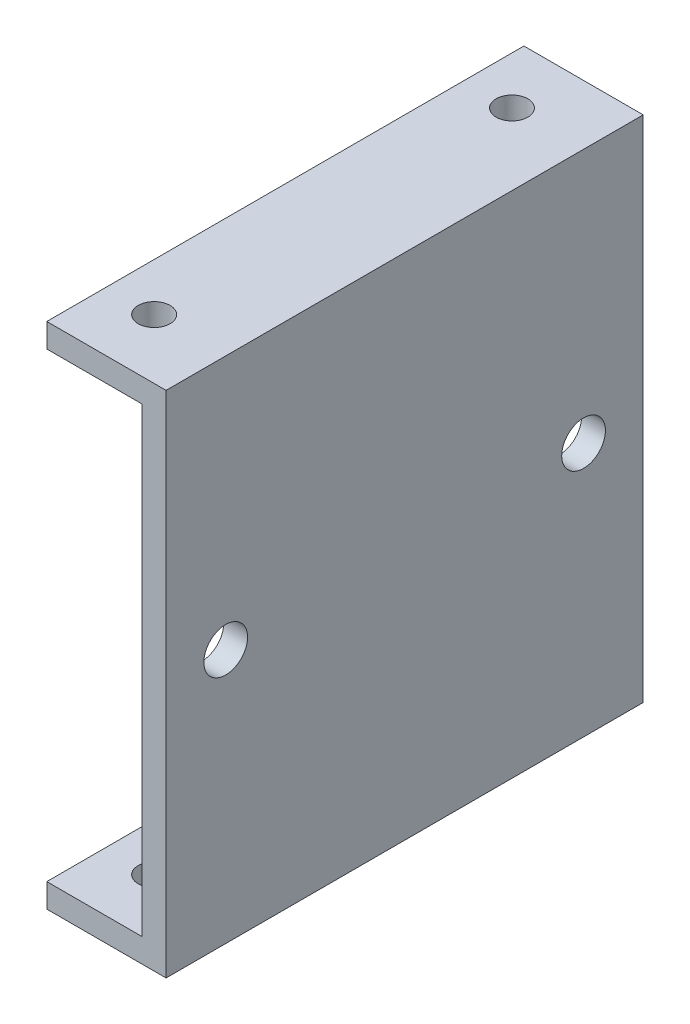
ISO-10303-21;
HEADER;
FILE_DESCRIPTION(('STEP AP214'),'2;1');
FILE_NAME('part.step','',(''),(''),'','','');
FILE_SCHEMA(('AUTOMOTIVE_DESIGN { 1 0 10303 214 1 1 1 1 }'));
ENDSEC;
DATA;
#1=APPLICATION_CONTEXT('core data for automotive mechanical design processes');
#2=APPLICATION_PROTOCOL_DEFINITION('international standard','automotive_design',2000,#1);
#3=PRODUCT_CONTEXT('',#1,'mechanical');
#4=PRODUCT('Part','Part','',(#3));
#5=PRODUCT_RELATED_PRODUCT_CATEGORY('part','',(#4));
#6=PRODUCT_DEFINITION_FORMATION('','',#4);
#7=PRODUCT_DEFINITION_CONTEXT('part definition',#1,'design');
#8=PRODUCT_DEFINITION('design','',#6,#7);
#9=PRODUCT_DEFINITION_SHAPE('','',#8);
#10=(LENGTH_UNIT() NAMED_UNIT(*) SI_UNIT(.MILLI.,.METRE.));
#11=(NAMED_UNIT(*) PLANE_ANGLE_UNIT() SI_UNIT($,.RADIAN.));
#12=(NAMED_UNIT(*) SI_UNIT($,.STERADIAN.) SOLID_ANGLE_UNIT());
#13=UNCERTAINTY_MEASURE_WITH_UNIT(LENGTH_MEASURE(1.E-05),#10,'distance_accuracy_value','');
#14=(GEOMETRIC_REPRESENTATION_CONTEXT(3) GLOBAL_UNCERTAINTY_ASSIGNED_CONTEXT((#13)) GLOBAL_UNIT_ASSIGNED_CONTEXT((#10,
#11,#12)) REPRESENTATION_CONTEXT('',''));
#15=CARTESIAN_POINT('',(0.,0.,0.));
#16=DIRECTION('',(0.,0.,1.));
#17=DIRECTION('',(1.,0.,0.));
#18=AXIS2_PLACEMENT_3D('',#15,#16,#17);
#19=CARTESIAN_POINT('',(0.,0.,30.));
#20=DIRECTION('',(1.,0.,0.));
#21=DIRECTION('',(0.,0.,-1.));
#22=AXIS2_PLACEMENT_3D('',#19,#20,#21);
#23=PLANE('',#22);
#24=DIRECTION('',(0.,-1.,0.));
#25=VECTOR('',#24,1.);
#26=CARTESIAN_POINT('',(0.,0.,-30.));
#27=LINE('',#26,#25);
#28=CARTESIAN_POINT('',(0.,0.,-30.));
#29=VERTEX_POINT('',#28);
#30=CARTESIAN_POINT('',(0.,-3.,-30.));
#31=VERTEX_POINT('',#30);
#32=EDGE_CURVE('E135',#29,#31,#27,.T.);
#33=ORIENTED_EDGE('',*,*,#32,.T.);
#34=DIRECTION('',(0.,0.,-1.));
#35=VECTOR('',#34,1.);
#36=CARTESIAN_POINT('',(0.,-3.,30.));
#37=LINE('',#36,#35);
#38=CARTESIAN_POINT('',(0.,-3.,30.));
#39=VERTEX_POINT('',#38);
#40=EDGE_CURVE('E11',#39,#31,#37,.T.);
#41=ORIENTED_EDGE('',*,*,#40,.F.);
#42=DIRECTION('',(0.,-1.,0.));
#43=VECTOR('',#42,1.);
#44=CARTESIAN_POINT('',(0.,0.,30.));
#45=LINE('',#44,#43);
#46=CARTESIAN_POINT('',(0.,0.,30.));
#47=VERTEX_POINT('',#46);
#48=EDGE_CURVE('E150',#47,#39,#45,.T.);
#49=ORIENTED_EDGE('',*,*,#48,.F.);
#50=DIRECTION('',(0.,0.,-1.));
#51=VECTOR('',#50,1.);
#52=CARTESIAN_POINT('',(0.,0.,30.));
#53=LINE('',#52,#51);
#54=EDGE_CURVE('E131',#47,#29,#53,.T.);
#55=ORIENTED_EDGE('',*,*,#54,.T.);
#56=EDGE_LOOP('',(#33,#41,#49,#55));
#57=FACE_BOUND('',#56,.T.);
#58=ADVANCED_FACE('F37',(#57),#23,.F.);
#59=CARTESIAN_POINT('',(0.,-3.,30.));
#60=DIRECTION('',(0.,1.,0.));
#61=DIRECTION('',(0.,0.,1.));
#62=AXIS2_PLACEMENT_3D('',#59,#60,#61);
#63=PLANE('',#62);
#64=CARTESIAN_POINT('',(6.,-3.,22.5));
#65=DIRECTION('',(0.,1.,0.));
#66=DIRECTION('',(0.,0.,1.));
#67=AXIS2_PLACEMENT_3D('',#64,#65,#66);
#68=CIRCLE('',#67,1.99999999999999);
#69=CARTESIAN_POINT('',(6.,-3.,24.5));
#70=VERTEX_POINT('',#69);
#71=EDGE_CURVE('E170',#70,#70,#68,.T.);
#72=ORIENTED_EDGE('',*,*,#71,.T.);
#73=EDGE_LOOP('',(#72));
#74=FACE_BOUND('',#73,.T.);
#75=CARTESIAN_POINT('',(6.,-3.,-22.5));
#76=DIRECTION('',(0.,1.,0.));
#77=DIRECTION('',(0.,0.,1.));
#78=AXIS2_PLACEMENT_3D('',#75,#76,#77);
#79=CIRCLE('',#78,1.99999999999999);
#80=CARTESIAN_POINT('',(6.,-3.,-20.5));
#81=VERTEX_POINT('',#80);
#82=EDGE_CURVE('E139',#81,#81,#79,.T.);
#83=ORIENTED_EDGE('',*,*,#82,.T.);
#84=EDGE_LOOP('',(#83));
#85=FACE_BOUND('',#84,.T.);
#86=DIRECTION('',(1.,0.,0.));
#87=VECTOR('',#86,1.);
#88=CARTESIAN_POINT('',(0.,-3.,-30.));
#89=LINE('',#88,#87);
#90=CARTESIAN_POINT('',(12.,-3.,-30.));
#91=VERTEX_POINT('',#90);
#92=EDGE_CURVE('E138',#31,#91,#89,.T.);
#93=ORIENTED_EDGE('',*,*,#92,.T.);
#94=DIRECTION('',(0.,0.,-1.));
#95=VECTOR('',#94,1.);
#96=CARTESIAN_POINT('',(12.,-3.,30.));
#97=LINE('',#96,#95);
#98=CARTESIAN_POINT('',(12.,-3.,30.));
#99=VERTEX_POINT('',#98);
#100=EDGE_CURVE('E46',#99,#91,#97,.T.);
#101=ORIENTED_EDGE('',*,*,#100,.F.);
#102=DIRECTION('',(1.,0.,0.));
#103=VECTOR('',#102,1.);
#104=CARTESIAN_POINT('',(0.,-3.,30.));
#105=LINE('',#104,#103);
#106=EDGE_CURVE('E98',#39,#99,#105,.T.);
#107=ORIENTED_EDGE('',*,*,#106,.F.);
#108=ORIENTED_EDGE('',*,*,#40,.T.);
#109=EDGE_LOOP('',(#93,#101,#107,#108));
#110=FACE_BOUND('',#109,.T.);
#111=ADVANCED_FACE('F218',(#74,#85,#110),#63,.F.);
#112=CARTESIAN_POINT('',(12.,-3.,30.));
#113=DIRECTION('',(1.,0.,0.));
#114=DIRECTION('',(0.,1.,0.));
#115=AXIS2_PLACEMENT_3D('',#112,#113,#114);
#116=PLANE('',#115);
#117=CARTESIAN_POINT('',(12.,-32.,-22.5));
#118=DIRECTION('',(1.,0.,0.));
#119=DIRECTION('',(0.,1.,0.));
#120=AXIS2_PLACEMENT_3D('',#117,#118,#119);
#121=CIRCLE('',#120,2.75);
#122=CARTESIAN_POINT('',(12.,-29.25,-22.5));
#123=VERTEX_POINT('',#122);
#124=EDGE_CURVE('E327',#123,#123,#121,.T.);
#125=ORIENTED_EDGE('',*,*,#124,.T.);
#126=EDGE_LOOP('',(#125));
#127=FACE_BOUND('',#126,.T.);
#128=CARTESIAN_POINT('',(12.,-32.,22.5));
#129=DIRECTION('',(1.,0.,0.));
#130=DIRECTION('',(0.,1.,0.));
#131=AXIS2_PLACEMENT_3D('',#128,#129,#130);
#132=CIRCLE('',#131,2.75);
#133=CARTESIAN_POINT('',(12.,-29.25,22.5));
#134=VERTEX_POINT('',#133);
#135=EDGE_CURVE('E245',#134,#134,#132,.T.);
#136=ORIENTED_EDGE('',*,*,#135,.T.);
#137=EDGE_LOOP('',(#136));
#138=FACE_BOUND('',#137,.T.);
#139=DIRECTION('',(0.,-1.,0.));
#140=VECTOR('',#139,1.);
#141=CARTESIAN_POINT('',(12.,-3.,-30.));
#142=LINE('',#141,#140);
#143=CARTESIAN_POINT('',(12.,-60.9999999999999,-30.));
#144=VERTEX_POINT('',#143);
#145=EDGE_CURVE('E141',#91,#144,#142,.T.);
#146=ORIENTED_EDGE('',*,*,#145,.T.);
#147=DIRECTION('',(0.,0.,-1.));
#148=VECTOR('',#147,1.);
#149=CARTESIAN_POINT('',(12.,-60.9999999999999,30.));
#150=LINE('',#149,#148);
#151=CARTESIAN_POINT('',(12.,-60.9999999999999,30.));
#152=VERTEX_POINT('',#151);
#153=EDGE_CURVE('E157',#152,#144,#150,.T.);
#154=ORIENTED_EDGE('',*,*,#153,.F.);
#155=DIRECTION('',(0.,-1.,0.));
#156=VECTOR('',#155,1.);
#157=CARTESIAN_POINT('',(12.,-3.,30.));
#158=LINE('',#157,#156);
#159=EDGE_CURVE('E183',#99,#152,#158,.T.);
#160=ORIENTED_EDGE('',*,*,#159,.F.);
#161=ORIENTED_EDGE('',*,*,#100,.T.);
#162=EDGE_LOOP('',(#146,#154,#160,#161));
#163=FACE_BOUND('',#162,.T.);
#164=ADVANCED_FACE('F222',(#127,#138,#163),#116,.F.);
#165=CARTESIAN_POINT('',(12.,-60.9999999999999,30.));
#166=DIRECTION('',(0.,-1.,0.));
#167=DIRECTION('',(0.,0.,-1.));
#168=AXIS2_PLACEMENT_3D('',#165,#166,#167);
#169=PLANE('',#168);
#170=CARTESIAN_POINT('',(6.,-60.9999999999999,22.5));
#171=DIRECTION('',(0.,-1.,0.));
#172=DIRECTION('',(0.,0.,-1.));
#173=AXIS2_PLACEMENT_3D('',#170,#171,#172);
#174=CIRCLE('',#173,1.99999999999999);
#175=CARTESIAN_POINT('',(6.,-60.9999999999999,20.5));
#176=VERTEX_POINT('',#175);
#177=EDGE_CURVE('E175',#176,#176,#174,.T.);
#178=ORIENTED_EDGE('',*,*,#177,.T.);
#179=EDGE_LOOP('',(#178));
#180=FACE_BOUND('',#179,.T.);
#181=CARTESIAN_POINT('',(6.,-60.9999999999999,-22.5));
#182=DIRECTION('',(0.,-1.,0.));
#183=DIRECTION('',(0.,0.,-1.));
#184=AXIS2_PLACEMENT_3D('',#181,#182,#183);
#185=CIRCLE('',#184,1.99999999999999);
#186=CARTESIAN_POINT('',(6.,-60.9999999999999,-24.5));
#187=VERTEX_POINT('',#186);
#188=EDGE_CURVE('E163',#187,#187,#185,.T.);
#189=ORIENTED_EDGE('',*,*,#188,.T.);
#190=EDGE_LOOP('',(#189));
#191=FACE_BOUND('',#190,.T.);
#192=DIRECTION('',(-1.,0.,0.));
#193=VECTOR('',#192,1.);
#194=CARTESIAN_POINT('',(12.,-60.9999999999999,-30.));
#195=LINE('',#194,#193);
#196=CARTESIAN_POINT('',(0.,-60.9999999999999,-30.));
#197=VERTEX_POINT('',#196);
#198=EDGE_CURVE('E143',#144,#197,#195,.T.);
#199=ORIENTED_EDGE('',*,*,#198,.T.);
#200=DIRECTION('',(0.,0.,-1.));
#201=VECTOR('',#200,1.);
#202=CARTESIAN_POINT('',(0.,-60.9999999999999,30.));
#203=LINE('',#202,#201);
#204=CARTESIAN_POINT('',(0.,-60.9999999999999,30.));
#205=VERTEX_POINT('',#204);
#206=EDGE_CURVE('E154',#205,#197,#203,.T.);
#207=ORIENTED_EDGE('',*,*,#206,.F.);
#208=DIRECTION('',(-1.,0.,0.));
#209=VECTOR('',#208,1.);
#210=CARTESIAN_POINT('',(12.,-60.9999999999999,30.));
#211=LINE('',#210,#209);
#212=EDGE_CURVE('E185',#152,#205,#211,.T.);
#213=ORIENTED_EDGE('',*,*,#212,.F.);
#214=ORIENTED_EDGE('',*,*,#153,.T.);
#215=EDGE_LOOP('',(#199,#207,#213,#214));
#216=FACE_BOUND('',#215,.T.);
#217=ADVANCED_FACE('F191',(#180,#191,#216),#169,.F.);
#218=CARTESIAN_POINT('',(0.,-60.9999999999999,30.));
#219=DIRECTION('',(1.,0.,0.));
#220=DIRECTION('',(0.,1.,0.));
#221=AXIS2_PLACEMENT_3D('',#218,#219,#220);
#222=PLANE('',#221);
#223=DIRECTION('',(0.,-1.,0.));
#224=VECTOR('',#223,1.);
#225=CARTESIAN_POINT('',(0.,-60.9999999999999,-30.));
#226=LINE('',#225,#224);
#227=CARTESIAN_POINT('',(0.,-63.9999999999999,-30.));
#228=VERTEX_POINT('',#227);
#229=EDGE_CURVE('E145',#197,#228,#226,.T.);
#230=ORIENTED_EDGE('',*,*,#229,.T.);
#231=DIRECTION('',(0.,0.,-1.));
#232=VECTOR('',#231,1.);
#233=CARTESIAN_POINT('',(0.,-63.9999999999999,30.));
#234=LINE('',#233,#232);
#235=CARTESIAN_POINT('',(0.,-63.9999999999999,30.));
#236=VERTEX_POINT('',#235);
#237=EDGE_CURVE('E126',#236,#228,#234,.T.);
#238=ORIENTED_EDGE('',*,*,#237,.F.);
#239=DIRECTION('',(0.,-1.,0.));
#240=VECTOR('',#239,1.);
#241=CARTESIAN_POINT('',(0.,-60.9999999999999,30.));
#242=LINE('',#241,#240);
#243=EDGE_CURVE('E117',#205,#236,#242,.T.);
#244=ORIENTED_EDGE('',*,*,#243,.F.);
#245=ORIENTED_EDGE('',*,*,#206,.T.);
#246=EDGE_LOOP('',(#230,#238,#244,#245));
#247=FACE_BOUND('',#246,.T.);
#248=ADVANCED_FACE('F195',(#247),#222,.F.);
#249=CARTESIAN_POINT('',(15.,-63.9999999999999,30.));
#250=DIRECTION('',(0.,1.,0.));
#251=DIRECTION('',(0.,0.,1.));
#252=AXIS2_PLACEMENT_3D('',#249,#250,#251);
#253=PLANE('',#252);
#254=CARTESIAN_POINT('',(6.,-63.9999999999999,22.5));
#255=DIRECTION('',(0.,1.,0.));
#256=DIRECTION('',(0.,0.,1.));
#257=AXIS2_PLACEMENT_3D('',#254,#255,#256);
#258=CIRCLE('',#257,1.99999999999999);
#259=CARTESIAN_POINT('',(6.,-63.9999999999999,24.5));
#260=VERTEX_POINT('',#259);
#261=EDGE_CURVE('E243',#260,#260,#258,.T.);
#262=ORIENTED_EDGE('',*,*,#261,.T.);
#263=EDGE_LOOP('',(#262));
#264=FACE_BOUND('',#263,.T.);
#265=CARTESIAN_POINT('',(6.,-63.9999999999999,-22.5));
#266=DIRECTION('',(0.,1.,0.));
#267=DIRECTION('',(0.,0.,1.));
#268=AXIS2_PLACEMENT_3D('',#265,#266,#267);
#269=CIRCLE('',#268,1.99999999999999);
#270=CARTESIAN_POINT('',(6.,-63.9999999999999,-20.5));
#271=VERTEX_POINT('',#270);
#272=EDGE_CURVE('E164',#271,#271,#269,.T.);
#273=ORIENTED_EDGE('',*,*,#272,.T.);
#274=EDGE_LOOP('',(#273));
#275=FACE_BOUND('',#274,.T.);
#276=DIRECTION('',(1.,0.,0.));
#277=VECTOR('',#276,1.);
#278=CARTESIAN_POINT('',(15.,-63.9999999999999,-30.));
#279=LINE('',#278,#277);
#280=CARTESIAN_POINT('',(15.,-63.9999999999999,-30.));
#281=VERTEX_POINT('',#280);
#282=EDGE_CURVE('E125',#228,#281,#279,.T.);
#283=ORIENTED_EDGE('',*,*,#282,.T.);
#284=DIRECTION('',(0.,0.,-1.));
#285=VECTOR('',#284,1.);
#286=CARTESIAN_POINT('',(15.,-63.9999999999999,30.));
#287=LINE('',#286,#285);
#288=CARTESIAN_POINT('',(15.,-63.9999999999999,30.));
#289=VERTEX_POINT('',#288);
#290=EDGE_CURVE('E122',#289,#281,#287,.T.);
#291=ORIENTED_EDGE('',*,*,#290,.F.);
#292=DIRECTION('',(1.,0.,0.));
#293=VECTOR('',#292,1.);
#294=CARTESIAN_POINT('',(15.,-63.9999999999999,30.));
#295=LINE('',#294,#293);
#296=EDGE_CURVE('E111',#236,#289,#295,.T.);
#297=ORIENTED_EDGE('',*,*,#296,.F.);
#298=ORIENTED_EDGE('',*,*,#237,.T.);
#299=EDGE_LOOP('',(#283,#291,#297,#298));
#300=FACE_BOUND('',#299,.T.);
#301=ADVANCED_FACE('F123',(#264,#275,#300),#253,.F.);
#302=CARTESIAN_POINT('',(15.,0.,30.));
#303=DIRECTION('',(-1.,0.,0.));
#304=DIRECTION('',(0.,-1.,0.));
#305=AXIS2_PLACEMENT_3D('',#302,#303,#304);
#306=PLANE('',#305);
#307=CARTESIAN_POINT('',(15.,-32.,-22.5));
#308=DIRECTION('',(1.,0.,0.));
#309=DIRECTION('',(0.,1.,0.));
#310=AXIS2_PLACEMENT_3D('',#307,#308,#309);
#311=CIRCLE('',#310,2.75);
#312=CARTESIAN_POINT('',(15.,-29.25,-22.5));
#313=VERTEX_POINT('',#312);
#314=EDGE_CURVE('E324',#313,#313,#311,.T.);
#315=ORIENTED_EDGE('',*,*,#314,.F.);
#316=EDGE_LOOP('',(#315));
#317=FACE_BOUND('',#316,.T.);
#318=CARTESIAN_POINT('',(15.,-32.,22.5));
#319=DIRECTION('',(1.,0.,0.));
#320=DIRECTION('',(0.,1.,0.));
#321=AXIS2_PLACEMENT_3D('',#318,#319,#320);
#322=CIRCLE('',#321,2.75);
#323=CARTESIAN_POINT('',(15.,-29.25,22.5));
#324=VERTEX_POINT('',#323);
#325=EDGE_CURVE('E248',#324,#324,#322,.T.);
#326=ORIENTED_EDGE('',*,*,#325,.F.);
#327=EDGE_LOOP('',(#326));
#328=FACE_BOUND('',#327,.T.);
#329=DIRECTION('',(0.,1.,0.));
#330=VECTOR('',#329,1.);
#331=CARTESIAN_POINT('',(15.,0.,-30.));
#332=LINE('',#331,#330);
#333=CARTESIAN_POINT('',(15.,0.,-30.));
#334=VERTEX_POINT('',#333);
#335=EDGE_CURVE('E84',#281,#334,#332,.T.);
#336=ORIENTED_EDGE('',*,*,#335,.T.);
#337=DIRECTION('',(0.,0.,-1.));
#338=VECTOR('',#337,1.);
#339=CARTESIAN_POINT('',(15.,0.,30.));
#340=LINE('',#339,#338);
#341=CARTESIAN_POINT('',(15.,0.,30.));
#342=VERTEX_POINT('',#341);
#343=EDGE_CURVE('E127',#342,#334,#340,.T.);
#344=ORIENTED_EDGE('',*,*,#343,.F.);
#345=DIRECTION('',(0.,1.,0.));
#346=VECTOR('',#345,1.);
#347=CARTESIAN_POINT('',(15.,0.,30.));
#348=LINE('',#347,#346);
#349=EDGE_CURVE('E115',#289,#342,#348,.T.);
#350=ORIENTED_EDGE('',*,*,#349,.F.);
#351=ORIENTED_EDGE('',*,*,#290,.T.);
#352=EDGE_LOOP('',(#336,#344,#350,#351));
#353=FACE_BOUND('',#352,.T.);
#354=ADVANCED_FACE('F129',(#317,#328,#353),#306,.F.);
#355=CARTESIAN_POINT('',(0.,0.,30.));
#356=DIRECTION('',(0.,-1.,0.));
#357=DIRECTION('',(0.,0.,-1.));
#358=AXIS2_PLACEMENT_3D('',#355,#356,#357);
#359=PLANE('',#358);
#360=CARTESIAN_POINT('',(6.,0.,22.5));
#361=DIRECTION('',(0.,-1.,0.));
#362=DIRECTION('',(0.,0.,-1.));
#363=AXIS2_PLACEMENT_3D('',#360,#361,#362);
#364=CIRCLE('',#363,1.99999999999999);
#365=CARTESIAN_POINT('',(6.,0.,20.5));
#366=VERTEX_POINT('',#365);
#367=EDGE_CURVE('E40',#366,#366,#364,.T.);
#368=ORIENTED_EDGE('',*,*,#367,.T.);
#369=EDGE_LOOP('',(#368));
#370=FACE_BOUND('',#369,.T.);
#371=CARTESIAN_POINT('',(6.,0.,-22.5));
#372=DIRECTION('',(0.,-1.,0.));
#373=DIRECTION('',(0.,0.,-1.));
#374=AXIS2_PLACEMENT_3D('',#371,#372,#373);
#375=CIRCLE('',#374,1.99999999999999);
#376=CARTESIAN_POINT('',(6.,0.,-24.5));
#377=VERTEX_POINT('',#376);
#378=EDGE_CURVE('E161',#377,#377,#375,.T.);
#379=ORIENTED_EDGE('',*,*,#378,.T.);
#380=EDGE_LOOP('',(#379));
#381=FACE_BOUND('',#380,.T.);
#382=DIRECTION('',(-1.,0.,0.));
#383=VECTOR('',#382,1.);
#384=CARTESIAN_POINT('',(0.,0.,-30.));
#385=LINE('',#384,#383);
#386=EDGE_CURVE('E90',#334,#29,#385,.T.);
#387=ORIENTED_EDGE('',*,*,#386,.T.);
#388=ORIENTED_EDGE('',*,*,#54,.F.);
#389=DIRECTION('',(-1.,0.,0.));
#390=VECTOR('',#389,1.);
#391=CARTESIAN_POINT('',(0.,0.,30.));
#392=LINE('',#391,#390);
#393=EDGE_CURVE('E55',#342,#47,#392,.T.);
#394=ORIENTED_EDGE('',*,*,#393,.F.);
#395=ORIENTED_EDGE('',*,*,#343,.T.);
#396=EDGE_LOOP('',(#387,#388,#394,#395));
#397=FACE_BOUND('',#396,.T.);
#398=ADVANCED_FACE('F203',(#370,#381,#397),#359,.F.);
#399=CARTESIAN_POINT('',(0.,0.,30.));
#400=DIRECTION('',(0.,0.,1.));
#401=DIRECTION('',(1.,0.,0.));
#402=AXIS2_PLACEMENT_3D('',#399,#400,#401);
#403=PLANE('',#402);
#404=ORIENTED_EDGE('',*,*,#48,.T.);
#405=ORIENTED_EDGE('',*,*,#106,.T.);
#406=ORIENTED_EDGE('',*,*,#159,.T.);
#407=ORIENTED_EDGE('',*,*,#212,.T.);
#408=ORIENTED_EDGE('',*,*,#243,.T.);
#409=ORIENTED_EDGE('',*,*,#296,.T.);
#410=ORIENTED_EDGE('',*,*,#349,.T.);
#411=ORIENTED_EDGE('',*,*,#393,.T.);
#412=EDGE_LOOP('',(#404,#405,#406,#407,#408,#409,#410,#411));
#413=FACE_BOUND('',#412,.T.);
#414=ADVANCED_FACE('F113',(#413),#403,.T.);
#415=CARTESIAN_POINT('',(0.,0.,-30.));
#416=DIRECTION('',(0.,0.,1.));
#417=DIRECTION('',(1.,0.,0.));
#418=AXIS2_PLACEMENT_3D('',#415,#416,#417);
#419=PLANE('',#418);
#420=ORIENTED_EDGE('',*,*,#32,.F.);
#421=ORIENTED_EDGE('',*,*,#386,.F.);
#422=ORIENTED_EDGE('',*,*,#335,.F.);
#423=ORIENTED_EDGE('',*,*,#282,.F.);
#424=ORIENTED_EDGE('',*,*,#229,.F.);
#425=ORIENTED_EDGE('',*,*,#198,.F.);
#426=ORIENTED_EDGE('',*,*,#145,.F.);
#427=ORIENTED_EDGE('',*,*,#92,.F.);
#428=EDGE_LOOP('',(#420,#421,#422,#423,#424,#425,#426,#427));
#429=FACE_BOUND('',#428,.T.);
#430=ADVANCED_FACE('F198',(#429),#419,.F.);
#431=CARTESIAN_POINT('',(6.,-63.9999999999999,-22.5));
#432=DIRECTION('',(0.,1.,0.));
#433=DIRECTION('',(0.,0.,1.));
#434=AXIS2_PLACEMENT_3D('',#431,#432,#433);
#435=CYLINDRICAL_SURFACE('',#434,1.99999999999999);
#436=ORIENTED_EDGE('',*,*,#378,.F.);
#437=EDGE_LOOP('',(#436));
#438=FACE_BOUND('',#437,.T.);
#439=ORIENTED_EDGE('',*,*,#82,.F.);
#440=EDGE_LOOP('',(#439));
#441=FACE_BOUND('',#440,.T.);
#442=ADVANCED_FACE('F271',(#438,#441),#435,.F.);
#443=ORIENTED_EDGE('',*,*,#272,.F.);
#444=EDGE_LOOP('',(#443));
#445=FACE_BOUND('',#444,.T.);
#446=ORIENTED_EDGE('',*,*,#188,.F.);
#447=EDGE_LOOP('',(#446));
#448=FACE_BOUND('',#447,.T.);
#449=ADVANCED_FACE('F267',(#445,#448),#435,.F.);
#450=CARTESIAN_POINT('',(6.,-63.9999999999999,22.5));
#451=DIRECTION('',(0.,1.,0.));
#452=DIRECTION('',(0.,0.,1.));
#453=AXIS2_PLACEMENT_3D('',#450,#451,#452);
#454=CYLINDRICAL_SURFACE('',#453,1.99999999999999);
#455=ORIENTED_EDGE('',*,*,#367,.F.);
#456=EDGE_LOOP('',(#455));
#457=FACE_BOUND('',#456,.T.);
#458=ORIENTED_EDGE('',*,*,#71,.F.);
#459=EDGE_LOOP('',(#458));
#460=FACE_BOUND('',#459,.T.);
#461=ADVANCED_FACE('F258',(#457,#460),#454,.F.);
#462=ORIENTED_EDGE('',*,*,#261,.F.);
#463=EDGE_LOOP('',(#462));
#464=FACE_BOUND('',#463,.T.);
#465=ORIENTED_EDGE('',*,*,#177,.F.);
#466=EDGE_LOOP('',(#465));
#467=FACE_BOUND('',#466,.T.);
#468=ADVANCED_FACE('F255',(#464,#467),#454,.F.);
#469=CARTESIAN_POINT('',(0.,-32.,22.5));
#470=DIRECTION('',(1.,0.,0.));
#471=DIRECTION('',(0.,1.,0.));
#472=AXIS2_PLACEMENT_3D('',#469,#470,#471);
#473=CYLINDRICAL_SURFACE('',#472,2.75);
#474=CARTESIAN_POINT('',(15.,-29.25,22.5));
#475=CARTESIAN_POINT('',(14.96875,-29.25,22.5));
#476=CARTESIAN_POINT('',(14.9375,-29.25,22.5));
#477=CARTESIAN_POINT('',(14.875,-29.25,22.5));
#478=CARTESIAN_POINT('',(14.84375,-29.25,22.5));
#479=CARTESIAN_POINT('',(14.78125,-29.25,22.5));
#480=CARTESIAN_POINT('',(14.75,-29.25,22.5));
#481=CARTESIAN_POINT('',(14.6875,-29.25,22.5));
#482=CARTESIAN_POINT('',(14.65625,-29.25,22.5));
#483=CARTESIAN_POINT('',(14.59375,-29.25,22.5));
#484=CARTESIAN_POINT('',(14.5625,-29.25,22.5));
#485=CARTESIAN_POINT('',(14.5,-29.25,22.5));
#486=CARTESIAN_POINT('',(14.46875,-29.25,22.5));
#487=CARTESIAN_POINT('',(14.40625,-29.25,22.5));
#488=CARTESIAN_POINT('',(14.375,-29.25,22.5));
#489=CARTESIAN_POINT('',(14.3125,-29.25,22.5));
#490=CARTESIAN_POINT('',(14.28125,-29.25,22.5));
#491=CARTESIAN_POINT('',(14.21875,-29.25,22.5));
#492=CARTESIAN_POINT('',(14.1875,-29.25,22.5));
#493=CARTESIAN_POINT('',(14.125,-29.25,22.5));
#494=CARTESIAN_POINT('',(14.09375,-29.25,22.5));
#495=CARTESIAN_POINT('',(14.03125,-29.25,22.5));
#496=CARTESIAN_POINT('',(14.,-29.25,22.5));
#497=CARTESIAN_POINT('',(13.9375,-29.25,22.5));
#498=CARTESIAN_POINT('',(13.90625,-29.25,22.5));
#499=CARTESIAN_POINT('',(13.84375,-29.25,22.5));
#500=CARTESIAN_POINT('',(13.8125,-29.25,22.5));
#501=CARTESIAN_POINT('',(13.75,-29.25,22.5));
#502=CARTESIAN_POINT('',(13.71875,-29.25,22.5));
#503=CARTESIAN_POINT('',(13.65625,-29.25,22.5));
#504=CARTESIAN_POINT('',(13.625,-29.25,22.5));
#505=CARTESIAN_POINT('',(13.5625,-29.25,22.5));
#506=CARTESIAN_POINT('',(13.53125,-29.25,22.5));
#507=CARTESIAN_POINT('',(13.46875,-29.25,22.5));
#508=CARTESIAN_POINT('',(13.4375,-29.25,22.5));
#509=CARTESIAN_POINT('',(13.375,-29.25,22.5));
#510=CARTESIAN_POINT('',(13.34375,-29.25,22.5));
#511=CARTESIAN_POINT('',(13.28125,-29.25,22.5));
#512=CARTESIAN_POINT('',(13.25,-29.25,22.5));
#513=CARTESIAN_POINT('',(13.1875,-29.25,22.5));
#514=CARTESIAN_POINT('',(13.15625,-29.25,22.5));
#515=CARTESIAN_POINT('',(13.09375,-29.25,22.5));
#516=CARTESIAN_POINT('',(13.0625,-29.25,22.5));
#517=CARTESIAN_POINT('',(13.,-29.25,22.5));
#518=CARTESIAN_POINT('',(12.96875,-29.25,22.5));
#519=CARTESIAN_POINT('',(12.90625,-29.25,22.5));
#520=CARTESIAN_POINT('',(12.875,-29.25,22.5));
#521=CARTESIAN_POINT('',(12.8125,-29.25,22.5));
#522=CARTESIAN_POINT('',(12.78125,-29.25,22.5));
#523=CARTESIAN_POINT('',(12.71875,-29.25,22.5));
#524=CARTESIAN_POINT('',(12.6875,-29.25,22.5));
#525=CARTESIAN_POINT('',(12.625,-29.25,22.5));
#526=CARTESIAN_POINT('',(12.59375,-29.25,22.5));
#527=CARTESIAN_POINT('',(12.53125,-29.25,22.5));
#528=CARTESIAN_POINT('',(12.5,-29.25,22.5));
#529=CARTESIAN_POINT('',(12.4375,-29.25,22.5));
#530=CARTESIAN_POINT('',(12.40625,-29.25,22.5));
#531=CARTESIAN_POINT('',(12.34375,-29.25,22.5));
#532=CARTESIAN_POINT('',(12.3125,-29.25,22.5));
#533=CARTESIAN_POINT('',(12.25,-29.25,22.5));
#534=CARTESIAN_POINT('',(12.21875,-29.25,22.5));
#535=CARTESIAN_POINT('',(12.15625,-29.25,22.5));
#536=CARTESIAN_POINT('',(12.125,-29.25,22.5));
#537=CARTESIAN_POINT('',(12.0625,-29.25,22.5));
#538=CARTESIAN_POINT('',(12.03125,-29.25,22.5));
#539=CARTESIAN_POINT('',(12.,-29.25,22.5));
#540=B_SPLINE_CURVE_WITH_KNOTS('',3,(#474,#475,#476,#477,#478,#479,#480,#481,#482,#483,#484,
#485,#486,#487,#488,#489,#490,#491,#492,#493,#494,#495,#496,#497,#498,#499,#500,#501,#502,#503,
#504,#505,#506,#507,#508,#509,#510,#511,#512,#513,#514,#515,#516,#517,#518,#519,#520,#521,#522,
#523,#524,#525,#526,#527,#528,#529,#530,#531,#532,#533,#534,#535,#536,#537,#538,#539),
.UNSPECIFIED.,.F.,.F.,(4,2,2,2,2,2,2,2,2,2,2,2,2,2,2,2,2,2,2,2,2,2,2,2,2,2,2,2,2,2,2,2,4),(0.,
0.0937500000000001,0.1875,0.28125,0.375,0.468749999999999,0.562499999999999,0.656249999999999,
0.749999999999999,0.843749999999999,0.937499999999999,1.03125,1.125,1.21875,1.3125,1.40625,1.5,
1.59375,1.6875,1.78125,1.875,1.96875,2.0625,2.15625,2.25,2.34375,2.4375,2.53125,2.625,2.71875,
2.8125,2.90625,3.),.UNSPECIFIED.);
#541=EDGE_CURVE('BSEAM257',#324,#134,#540,.T.);
#542=ORIENTED_EDGE('',*,*,#325,.T.);
#543=ORIENTED_EDGE('',*,*,#135,.F.);
#544=ORIENTED_EDGE('',*,*,#541,.T.);
#545=ORIENTED_EDGE('',*,*,#541,.F.);
#546=EDGE_LOOP('',(#542,#544,#543,#545));
#547=FACE_BOUND('',#546,.T.);
#548=ADVANCED_FACE('F257',(#547),#473,.F.);
#549=CARTESIAN_POINT('',(0.,-32.,-22.5));
#550=DIRECTION('',(1.,0.,0.));
#551=DIRECTION('',(0.,1.,0.));
#552=AXIS2_PLACEMENT_3D('',#549,#550,#551);
#553=CYLINDRICAL_SURFACE('',#552,2.75);
#554=CARTESIAN_POINT('',(15.,-29.25,-22.5));
#555=CARTESIAN_POINT('',(14.96875,-29.25,-22.5));
#556=CARTESIAN_POINT('',(14.9375,-29.25,-22.5));
#557=CARTESIAN_POINT('',(14.875,-29.25,-22.5));
#558=CARTESIAN_POINT('',(14.84375,-29.25,-22.5));
#559=CARTESIAN_POINT('',(14.78125,-29.25,-22.5));
#560=CARTESIAN_POINT('',(14.75,-29.25,-22.5));
#561=CARTESIAN_POINT('',(14.6875,-29.25,-22.5));
#562=CARTESIAN_POINT('',(14.65625,-29.25,-22.5));
#563=CARTESIAN_POINT('',(14.59375,-29.25,-22.5));
#564=CARTESIAN_POINT('',(14.5625,-29.25,-22.5));
#565=CARTESIAN_POINT('',(14.5,-29.25,-22.5));
#566=CARTESIAN_POINT('',(14.46875,-29.25,-22.5));
#567=CARTESIAN_POINT('',(14.40625,-29.25,-22.5));
#568=CARTESIAN_POINT('',(14.375,-29.25,-22.5));
#569=CARTESIAN_POINT('',(14.3125,-29.25,-22.5));
#570=CARTESIAN_POINT('',(14.28125,-29.25,-22.5));
#571=CARTESIAN_POINT('',(14.21875,-29.25,-22.5));
#572=CARTESIAN_POINT('',(14.1875,-29.25,-22.5));
#573=CARTESIAN_POINT('',(14.125,-29.25,-22.5));
#574=CARTESIAN_POINT('',(14.09375,-29.25,-22.5));
#575=CARTESIAN_POINT('',(14.03125,-29.25,-22.5));
#576=CARTESIAN_POINT('',(14.,-29.25,-22.5));
#577=CARTESIAN_POINT('',(13.9375,-29.25,-22.5));
#578=CARTESIAN_POINT('',(13.90625,-29.25,-22.5));
#579=CARTESIAN_POINT('',(13.84375,-29.25,-22.5));
#580=CARTESIAN_POINT('',(13.8125,-29.25,-22.5));
#581=CARTESIAN_POINT('',(13.75,-29.25,-22.5));
#582=CARTESIAN_POINT('',(13.71875,-29.25,-22.5));
#583=CARTESIAN_POINT('',(13.65625,-29.25,-22.5));
#584=CARTESIAN_POINT('',(13.625,-29.25,-22.5));
#585=CARTESIAN_POINT('',(13.5625,-29.25,-22.5));
#586=CARTESIAN_POINT('',(13.53125,-29.25,-22.5));
#587=CARTESIAN_POINT('',(13.46875,-29.25,-22.5));
#588=CARTESIAN_POINT('',(13.4375,-29.25,-22.5));
#589=CARTESIAN_POINT('',(13.375,-29.25,-22.5));
#590=CARTESIAN_POINT('',(13.34375,-29.25,-22.5));
#591=CARTESIAN_POINT('',(13.28125,-29.25,-22.5));
#592=CARTESIAN_POINT('',(13.25,-29.25,-22.5));
#593=CARTESIAN_POINT('',(13.1875,-29.25,-22.5));
#594=CARTESIAN_POINT('',(13.15625,-29.25,-22.5));
#595=CARTESIAN_POINT('',(13.09375,-29.25,-22.5));
#596=CARTESIAN_POINT('',(13.0625,-29.25,-22.5));
#597=CARTESIAN_POINT('',(13.,-29.25,-22.5));
#598=CARTESIAN_POINT('',(12.96875,-29.25,-22.5));
#599=CARTESIAN_POINT('',(12.90625,-29.25,-22.5));
#600=CARTESIAN_POINT('',(12.875,-29.25,-22.5));
#601=CARTESIAN_POINT('',(12.8125,-29.25,-22.5));
#602=CARTESIAN_POINT('',(12.78125,-29.25,-22.5));
#603=CARTESIAN_POINT('',(12.71875,-29.25,-22.5));
#604=CARTESIAN_POINT('',(12.6875,-29.25,-22.5));
#605=CARTESIAN_POINT('',(12.625,-29.25,-22.5));
#606=CARTESIAN_POINT('',(12.59375,-29.25,-22.5));
#607=CARTESIAN_POINT('',(12.53125,-29.25,-22.5));
#608=CARTESIAN_POINT('',(12.5,-29.25,-22.5));
#609=CARTESIAN_POINT('',(12.4375,-29.25,-22.5));
#610=CARTESIAN_POINT('',(12.40625,-29.25,-22.5));
#611=CARTESIAN_POINT('',(12.34375,-29.25,-22.5));
#612=CARTESIAN_POINT('',(12.3125,-29.25,-22.5));
#613=CARTESIAN_POINT('',(12.25,-29.25,-22.5));
#614=CARTESIAN_POINT('',(12.21875,-29.25,-22.5));
#615=CARTESIAN_POINT('',(12.15625,-29.25,-22.5));
#616=CARTESIAN_POINT('',(12.125,-29.25,-22.5));
#617=CARTESIAN_POINT('',(12.0625,-29.25,-22.5));
#618=CARTESIAN_POINT('',(12.03125,-29.25,-22.5));
#619=CARTESIAN_POINT('',(12.,-29.25,-22.5));
#620=B_SPLINE_CURVE_WITH_KNOTS('',3,(#554,#555,#556,#557,#558,#559,#560,#561,#562,#563,#564,
#565,#566,#567,#568,#569,#570,#571,#572,#573,#574,#575,#576,#577,#578,#579,#580,#581,#582,#583,
#584,#585,#586,#587,#588,#589,#590,#591,#592,#593,#594,#595,#596,#597,#598,#599,#600,#601,#602,
#603,#604,#605,#606,#607,#608,#609,#610,#611,#612,#613,#614,#615,#616,#617,#618,#619),
.UNSPECIFIED.,.F.,.F.,(4,2,2,2,2,2,2,2,2,2,2,2,2,2,2,2,2,2,2,2,2,2,2,2,2,2,2,2,2,2,2,2,4),(0.,
0.0937500000000001,0.1875,0.28125,0.375,0.468749999999999,0.562499999999999,0.656249999999999,
0.749999999999999,0.843749999999999,0.937499999999999,1.03125,1.125,1.21875,1.3125,1.40625,1.5,
1.59375,1.6875,1.78125,1.875,1.96875,2.0625,2.15625,2.25,2.34375,2.4375,2.53125,2.625,2.71875,
2.8125,2.90625,3.),.UNSPECIFIED.);
#621=EDGE_CURVE('BSEAM264',#313,#123,#620,.T.);
#622=ORIENTED_EDGE('',*,*,#314,.T.);
#623=ORIENTED_EDGE('',*,*,#124,.F.);
#624=ORIENTED_EDGE('',*,*,#621,.T.);
#625=ORIENTED_EDGE('',*,*,#621,.F.);
#626=EDGE_LOOP('',(#622,#624,#623,#625));
#627=FACE_BOUND('',#626,.T.);
#628=ADVANCED_FACE('F264',(#627),#553,.F.);
#629=CLOSED_SHELL('',(#58,#111,#164,#217,#248,#301,#354,#398,#414,#430,#442,#449,#461,#468,#548,#628));
#630=MANIFOLD_SOLID_BREP('B2',#629);
#631=ADVANCED_BREP_SHAPE_REPRESENTATION('',(#18,#630),#14);
#632=SHAPE_DEFINITION_REPRESENTATION(#9,#631);
ENDSEC;
END-ISO-10303-21;
